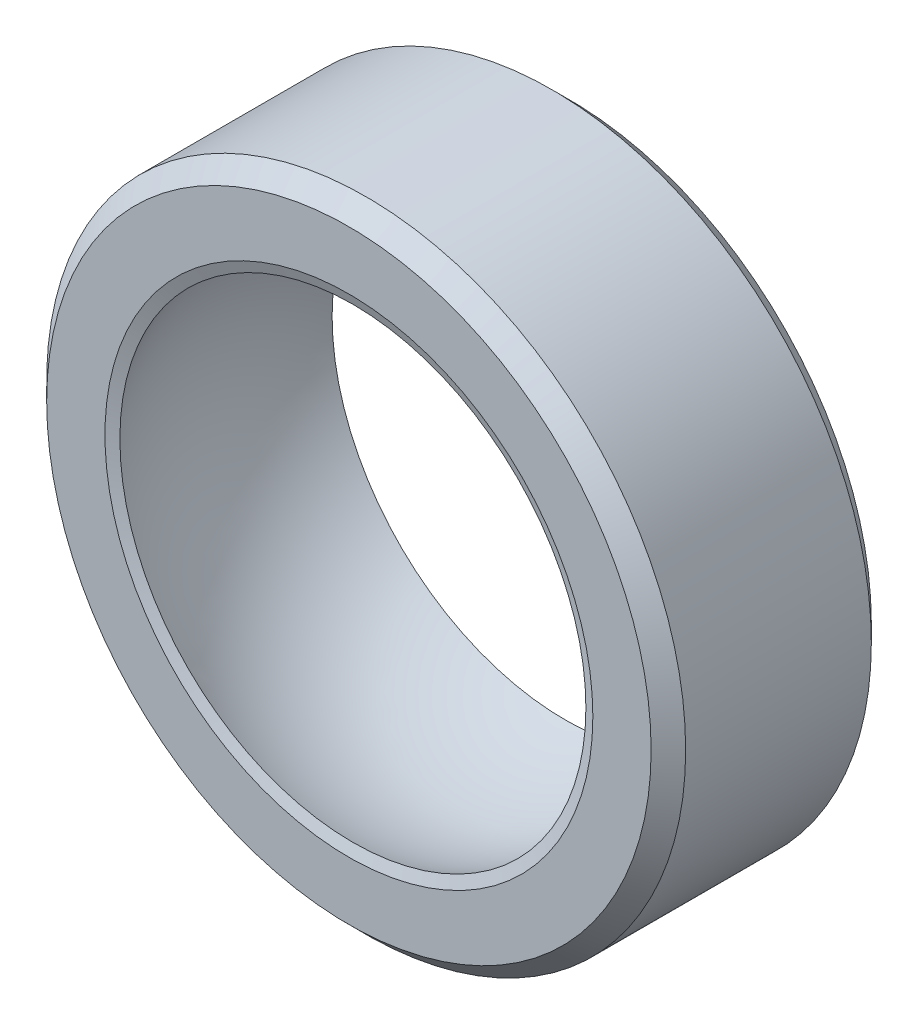
ISO-10303-21;
HEADER;
FILE_DESCRIPTION(('STEP AP214'),'2;1');
FILE_NAME('part.step','',(''),(''),'','','');
FILE_SCHEMA(('AUTOMOTIVE_DESIGN { 1 0 10303 214 1 1 1 1 }'));
ENDSEC;
DATA;
#1=APPLICATION_CONTEXT('core data for automotive mechanical design processes');
#2=APPLICATION_PROTOCOL_DEFINITION('international standard','automotive_design',2000,#1);
#3=PRODUCT_CONTEXT('',#1,'mechanical');
#4=PRODUCT('Part','Part','',(#3));
#5=PRODUCT_RELATED_PRODUCT_CATEGORY('part','',(#4));
#6=PRODUCT_DEFINITION_FORMATION('','',#4);
#7=PRODUCT_DEFINITION_CONTEXT('part definition',#1,'design');
#8=PRODUCT_DEFINITION('design','',#6,#7);
#9=PRODUCT_DEFINITION_SHAPE('','',#8);
#10=(LENGTH_UNIT() NAMED_UNIT(*) SI_UNIT(.MILLI.,.METRE.));
#11=(NAMED_UNIT(*) PLANE_ANGLE_UNIT() SI_UNIT($,.RADIAN.));
#12=(NAMED_UNIT(*) SI_UNIT($,.STERADIAN.) SOLID_ANGLE_UNIT());
#13=UNCERTAINTY_MEASURE_WITH_UNIT(LENGTH_MEASURE(1.E-05),#10,'distance_accuracy_value','');
#14=(GEOMETRIC_REPRESENTATION_CONTEXT(3) GLOBAL_UNCERTAINTY_ASSIGNED_CONTEXT((#13)) GLOBAL_UNIT_ASSIGNED_CONTEXT((#10,
#11,#12)) REPRESENTATION_CONTEXT('',''));
#15=CARTESIAN_POINT('',(0.,0.,0.));
#16=DIRECTION('',(0.,0.,1.));
#17=DIRECTION('',(1.,0.,0.));
#18=AXIS2_PLACEMENT_3D('',#15,#16,#17);
#19=CARTESIAN_POINT('',(0.,0.,-3.2385));
#20=DIRECTION('',(0.,0.,1.));
#21=DIRECTION('',(1.,0.,0.));
#22=AXIS2_PLACEMENT_3D('',#19,#20,#21);
#23=CONICAL_SURFACE('',#22,8.89,0.78539816339745);
#24=CARTESIAN_POINT('',(0.,0.,-2.7305));
#25=DIRECTION('',(0.,0.,1.));
#26=DIRECTION('',(1.,0.,0.));
#27=AXIS2_PLACEMENT_3D('',#24,#25,#26);
#28=CIRCLE('',#27,9.398);
#29=CARTESIAN_POINT('',(9.398,0.,-2.7305));
#30=VERTEX_POINT('',#29);
#31=EDGE_CURVE('E10',#30,#30,#28,.T.);
#32=ORIENTED_EDGE('',*,*,#31,.F.);
#33=EDGE_LOOP('',(#32));
#34=FACE_BOUND('',#33,.T.);
#35=CARTESIAN_POINT('',(0.,0.,-3.2385));
#36=DIRECTION('',(0.,0.,1.));
#37=DIRECTION('',(1.,0.,0.));
#38=AXIS2_PLACEMENT_3D('',#35,#36,#37);
#39=CIRCLE('',#38,8.89);
#40=CARTESIAN_POINT('',(8.89,0.,-3.2385));
#41=VERTEX_POINT('',#40);
#42=EDGE_CURVE('E69',#41,#41,#39,.T.);
#43=ORIENTED_EDGE('',*,*,#42,.T.);
#44=EDGE_LOOP('',(#43));
#45=FACE_BOUND('',#44,.T.);
#46=ADVANCED_FACE('F41',(#34,#45),#23,.T.);
#47=CARTESIAN_POINT('',(0.,0.,3.));
#48=DIRECTION('',(0.,0.,1.));
#49=DIRECTION('',(1.,0.,0.));
#50=AXIS2_PLACEMENT_3D('',#47,#48,#49);
#51=CYLINDRICAL_SURFACE('',#50,9.398);
#52=CARTESIAN_POINT('',(0.,0.,2.7305));
#53=DIRECTION('',(0.,0.,1.));
#54=DIRECTION('',(1.,0.,0.));
#55=AXIS2_PLACEMENT_3D('',#52,#53,#54);
#56=CIRCLE('',#55,9.398);
#57=CARTESIAN_POINT('',(9.398,0.,2.7305));
#58=VERTEX_POINT('',#57);
#59=EDGE_CURVE('E47',#58,#58,#56,.T.);
#60=ORIENTED_EDGE('',*,*,#59,.F.);
#61=EDGE_LOOP('',(#60));
#62=FACE_BOUND('',#61,.T.);
#63=ORIENTED_EDGE('',*,*,#31,.T.);
#64=EDGE_LOOP('',(#63));
#65=FACE_BOUND('',#64,.T.);
#66=ADVANCED_FACE('F106',(#62,#65),#51,.T.);
#67=CARTESIAN_POINT('',(0.,0.,2.7305));
#68=DIRECTION('',(0.,0.,-1.));
#69=DIRECTION('',(-1.,0.,0.));
#70=AXIS2_PLACEMENT_3D('',#67,#68,#69);
#71=CONICAL_SURFACE('',#70,9.398,0.785398163397448);
#72=CARTESIAN_POINT('',(0.,0.,3.2385));
#73=DIRECTION('',(0.,0.,1.));
#74=DIRECTION('',(1.,0.,0.));
#75=AXIS2_PLACEMENT_3D('',#72,#73,#74);
#76=CIRCLE('',#75,8.89);
#77=CARTESIAN_POINT('',(8.89,0.,3.2385));
#78=VERTEX_POINT('',#77);
#79=EDGE_CURVE('E51',#78,#78,#76,.T.);
#80=ORIENTED_EDGE('',*,*,#79,.F.);
#81=EDGE_LOOP('',(#80));
#82=FACE_BOUND('',#81,.T.);
#83=ORIENTED_EDGE('',*,*,#59,.T.);
#84=EDGE_LOOP('',(#83));
#85=FACE_BOUND('',#84,.T.);
#86=ADVANCED_FACE('F101',(#82,#85),#71,.T.);
#87=CARTESIAN_POINT('',(-8.89,0.,3.2385));
#88=DIRECTION('',(0.,0.,-1.));
#89=DIRECTION('',(-1.,0.,0.));
#90=AXIS2_PLACEMENT_3D('',#87,#88,#89);
#91=PLANE('',#90);
#92=CARTESIAN_POINT('',(0.,0.,3.2385));
#93=DIRECTION('',(0.,0.,1.));
#94=DIRECTION('',(1.,0.,0.));
#95=AXIS2_PLACEMENT_3D('',#92,#93,#94);
#96=CIRCLE('',#95,7.17579);
#97=CARTESIAN_POINT('',(7.17579,0.,3.2385));
#98=VERTEX_POINT('',#97);
#99=EDGE_CURVE('E55',#98,#98,#96,.T.);
#100=ORIENTED_EDGE('',*,*,#99,.F.);
#101=EDGE_LOOP('',(#100));
#102=FACE_BOUND('',#101,.T.);
#103=ORIENTED_EDGE('',*,*,#79,.T.);
#104=EDGE_LOOP('',(#103));
#105=FACE_BOUND('',#104,.T.);
#106=ADVANCED_FACE('F95',(#102,#105),#91,.F.);
#107=CARTESIAN_POINT('',(0.,0.,3.2385));
#108=DIRECTION('',(0.,0.,1.));
#109=DIRECTION('',(1.,0.,0.));
#110=AXIS2_PLACEMENT_3D('',#107,#108,#109);
#111=CONICAL_SURFACE('',#110,7.17579,1.22191309760307);
#112=CARTESIAN_POINT('',(0.,0.,3.12139));
#113=DIRECTION('',(0.,0.,1.));
#114=DIRECTION('',(1.,0.,0.));
#115=AXIS2_PLACEMENT_3D('',#112,#113,#114);
#116=CIRCLE('',#115,6.85385);
#117=CARTESIAN_POINT('',(-6.85385,0.,3.12139));
#118=VERTEX_POINT('',#117);
#119=EDGE_CURVE('E60',#118,#118,#116,.T.);
#120=ORIENTED_EDGE('',*,*,#119,.F.);
#121=EDGE_LOOP('',(#120));
#122=FACE_BOUND('',#121,.T.);
#123=ORIENTED_EDGE('',*,*,#99,.T.);
#124=EDGE_LOOP('',(#123));
#125=FACE_BOUND('',#124,.T.);
#126=ADVANCED_FACE('F89',(#122,#125),#111,.F.);
#127=CARTESIAN_POINT('',(0.,0.,0.));
#128=DIRECTION('',(0.,0.,1.));
#129=DIRECTION('',(-1.,0.,0.));
#130=AXIS2_PLACEMENT_3D('',#127,#128,#129);
#131=SPHERICAL_SURFACE('',#130,7.53115763708343);
#132=CARTESIAN_POINT('',(0.,0.,-3.12139));
#133=DIRECTION('',(0.,0.,1.));
#134=DIRECTION('',(1.,0.,0.));
#135=AXIS2_PLACEMENT_3D('',#132,#133,#134);
#136=CIRCLE('',#135,6.85385);
#137=CARTESIAN_POINT('',(-6.85385,0.,-3.12139));
#138=VERTEX_POINT('',#137);
#139=EDGE_CURVE('E63',#138,#138,#136,.T.);
#140=CARTESIAN_POINT('',(-6.85385,0.,-3.12139));
#141=CARTESIAN_POINT('',(-6.88164054543853,0.,-3.06036894760343));
#142=CARTESIAN_POINT('',(-6.90861575213382,0.,-2.99897658415096));
#143=CARTESIAN_POINT('',(-6.96091717276811,0.,-2.87549342287617));
#144=CARTESIAN_POINT('',(-6.98624338670709,0.,-2.81340262505383));
#145=CARTESIAN_POINT('',(-7.03522850655887,0.,-2.6885667827812));
#146=CARTESIAN_POINT('',(-7.05888741247168,0.,-2.6258217383309));
#147=CARTESIAN_POINT('',(-7.1045211055855,0.,-2.49972219075851));
#148=CARTESIAN_POINT('',(-7.12649589278653,0.,-2.43636768763641));
#149=CARTESIAN_POINT('',(-7.16874565471623,0.,-2.3090944096678));
#150=CARTESIAN_POINT('',(-7.18902062944492,0.,-2.24517563482129));
#151=CARTESIAN_POINT('',(-7.22785630787594,0.,-2.11681941246455));
#152=CARTESIAN_POINT('',(-7.24641701157827,0.,-2.05238196495431));
#153=CARTESIAN_POINT('',(-7.28181090622963,0.,-1.92303436376237));
#154=CARTESIAN_POINT('',(-7.29864409717864,0.,-1.85812421008065));
#155=CARTESIAN_POINT('',(-7.33057095855796,0.,-1.72787750093535));
#156=CARTESIAN_POINT('',(-7.34566462898825,0.,-1.66254094547177));
#157=CARTESIAN_POINT('',(-7.37410168203206,0.,-1.53148804114553));
#158=CARTESIAN_POINT('',(-7.38744506464556,0.,-1.46577169228287));
#159=CARTESIAN_POINT('',(-7.41237202345795,0.,-1.33400608051972));
#160=CARTESIAN_POINT('',(-7.42395559965684,0.,-1.26795681761923));
#161=CARTESIAN_POINT('',(-7.44535468238475,0.,-1.13557249461566));
#162=CARTESIAN_POINT('',(-7.45517018891376,0.,-1.06923743451257));
#163=CARTESIAN_POINT('',(-7.47302613032346,0.,-0.936328837818619));
#164=CARTESIAN_POINT('',(-7.48106656520415,0.,-0.869755301227748));
#165=CARTESIAN_POINT('',(-7.49536662759993,0.,-0.736417242391426));
#166=CARTESIAN_POINT('',(-7.50162625511502,0.,-0.669652720145976));
#167=CARTESIAN_POINT('',(-7.5123602374179,0.,-0.5359803170753));
#168=CARTESIAN_POINT('',(-7.51683459220569,0.,-0.469072436250075));
#169=CARTESIAN_POINT('',(-7.52399483723257,0.,-0.335161045360723));
#170=CARTESIAN_POINT('',(-7.52668072747166,0.,-0.268157535296596));
#171=CARTESIAN_POINT('',(-7.53026212739709,0.,-0.134102683488313));
#172=CARTESIAN_POINT('',(-7.53115763708343,0.,-0.0670513417441574));
#173=CARTESIAN_POINT('',(-7.53115763708343,0.,0.0670513417441541));
#174=CARTESIAN_POINT('',(-7.53026212739709,0.,0.13410268348831));
#175=CARTESIAN_POINT('',(-7.52668072747166,0.,0.268157535296592));
#176=CARTESIAN_POINT('',(-7.52399483723258,0.,0.335161045360719));
#177=CARTESIAN_POINT('',(-7.51683459220569,0.,0.469072436250071));
#178=CARTESIAN_POINT('',(-7.5123602374179,0.,0.535980317075297));
#179=CARTESIAN_POINT('',(-7.50162625511502,0.,0.669652720145972));
#180=CARTESIAN_POINT('',(-7.49536662759993,0.,0.736417242391423));
#181=CARTESIAN_POINT('',(-7.48106656520415,0.,0.869755301227745));
#182=CARTESIAN_POINT('',(-7.47302613032346,0.,0.936328837818616));
#183=CARTESIAN_POINT('',(-7.45517018891376,0.,1.06923743451257));
#184=CARTESIAN_POINT('',(-7.44535468238475,0.,1.13557249461565));
#185=CARTESIAN_POINT('',(-7.42395559965684,0.,1.26795681761923));
#186=CARTESIAN_POINT('',(-7.41237202345795,0.,1.33400608051972));
#187=CARTESIAN_POINT('',(-7.38744506464556,0.,1.46577169228287));
#188=CARTESIAN_POINT('',(-7.37410168203206,0.,1.53148804114553));
#189=CARTESIAN_POINT('',(-7.34566462898826,0.,1.66254094547177));
#190=CARTESIAN_POINT('',(-7.33057095855796,0.,1.72787750093535));
#191=CARTESIAN_POINT('',(-7.29864409717864,0.,1.85812421008065));
#192=CARTESIAN_POINT('',(-7.28181090622963,0.,1.92303436376236));
#193=CARTESIAN_POINT('',(-7.24641701157827,0.,2.05238196495431));
#194=CARTESIAN_POINT('',(-7.22785630787594,0.,2.11681941246454));
#195=CARTESIAN_POINT('',(-7.18902062944492,0.,2.24517563482129));
#196=CARTESIAN_POINT('',(-7.16874565471624,0.,2.3090944096678));
#197=CARTESIAN_POINT('',(-7.12649589278653,0.,2.43636768763641));
#198=CARTESIAN_POINT('',(-7.1045211055855,0.,2.49972219075851));
#199=CARTESIAN_POINT('',(-7.05888741247168,0.,2.6258217383309));
#200=CARTESIAN_POINT('',(-7.03522850655888,0.,2.6885667827812));
#201=CARTESIAN_POINT('',(-6.98624338670709,0.,2.81340262505383));
#202=CARTESIAN_POINT('',(-6.96091717276811,0.,2.87549342287616));
#203=CARTESIAN_POINT('',(-6.90861575213383,0.,2.99897658415096));
#204=CARTESIAN_POINT('',(-6.88164054543853,0.,3.06036894760342));
#205=CARTESIAN_POINT('',(-6.85385,0.,3.12139));
#206=B_SPLINE_CURVE_WITH_KNOTS('',3,(#140,#141,#142,#143,#144,#145,#146,#147,#148,#149,#150,
#151,#152,#153,#154,#155,#156,#157,#158,#159,#160,#161,#162,#163,#164,#165,#166,#167,#168,#169,
#170,#171,#172,#173,#174,#175,#176,#177,#178,#179,#180,#181,#182,#183,#184,#185,#186,#187,#188,
#189,#190,#191,#192,#193,#194,#195,#196,#197,#198,#199,#200,#201,#202,#203,#204,#205),
.UNSPECIFIED.,.F.,.F.,(4,2,2,2,2,2,2,2,2,2,2,2,2,2,2,2,2,2,2,2,2,2,2,2,2,2,2,2,2,2,2,2,4),(0.,
0.201148046539107,0.402296093078214,0.603444139617321,0.804592186156427,1.00574023269553,
1.20688827923464,1.40803632577375,1.60918437231285,1.81033241885196,2.01148046539107,
2.21262851193017,2.41377655846928,2.61492460500839,2.8160726515475,3.0172206980866,
3.21836874462571,3.41951679116482,3.62066483770392,3.82181288424303,4.02296093078214,
4.22410897732124,4.42525702386035,4.62640507039946,4.82755311693856,5.02870116347767,
5.22984921001678,5.43099725655588,5.63214530309499,5.8332933496341,6.03444139617321,
6.23558944271231,6.43673748925142),.UNSPECIFIED.);
#207=EDGE_CURVE('BSEAM83',#138,#118,#206,.T.);
#208=ORIENTED_EDGE('',*,*,#139,.F.);
#209=ORIENTED_EDGE('',*,*,#119,.T.);
#210=ORIENTED_EDGE('',*,*,#207,.T.);
#211=ORIENTED_EDGE('',*,*,#207,.F.);
#212=EDGE_LOOP('',(#208,#210,#209,#211));
#213=FACE_BOUND('',#212,.T.);
#214=ADVANCED_FACE('F83',(#213),#131,.F.);
#215=CARTESIAN_POINT('',(0.,0.,-3.12139));
#216=DIRECTION('',(0.,0.,-1.));
#217=DIRECTION('',(-1.,0.,0.));
#218=AXIS2_PLACEMENT_3D('',#215,#216,#217);
#219=CONICAL_SURFACE('',#218,6.85385,1.22191309760308);
#220=CARTESIAN_POINT('',(0.,0.,-3.2385));
#221=DIRECTION('',(0.,0.,1.));
#222=DIRECTION('',(1.,0.,0.));
#223=AXIS2_PLACEMENT_3D('',#220,#221,#222);
#224=CIRCLE('',#223,7.17579);
#225=CARTESIAN_POINT('',(7.17579,0.,-3.2385));
#226=VERTEX_POINT('',#225);
#227=EDGE_CURVE('E66',#226,#226,#224,.T.);
#228=ORIENTED_EDGE('',*,*,#227,.F.);
#229=EDGE_LOOP('',(#228));
#230=FACE_BOUND('',#229,.T.);
#231=ORIENTED_EDGE('',*,*,#139,.T.);
#232=EDGE_LOOP('',(#231));
#233=FACE_BOUND('',#232,.T.);
#234=ADVANCED_FACE('F77',(#230,#233),#219,.F.);
#235=CARTESIAN_POINT('',(-8.89,0.,-3.2385));
#236=DIRECTION('',(0.,0.,1.));
#237=DIRECTION('',(1.,0.,0.));
#238=AXIS2_PLACEMENT_3D('',#235,#236,#237);
#239=PLANE('',#238);
#240=ORIENTED_EDGE('',*,*,#42,.F.);
#241=EDGE_LOOP('',(#240));
#242=FACE_BOUND('',#241,.T.);
#243=ORIENTED_EDGE('',*,*,#227,.T.);
#244=EDGE_LOOP('',(#243));
#245=FACE_BOUND('',#244,.T.);
#246=ADVANCED_FACE('F74',(#242,#245),#239,.F.);
#247=CLOSED_SHELL('',(#46,#66,#86,#106,#126,#214,#234,#246));
#248=MANIFOLD_SOLID_BREP('B2',#247);
#249=ADVANCED_BREP_SHAPE_REPRESENTATION('',(#18,#248),#14);
#250=SHAPE_DEFINITION_REPRESENTATION(#9,#249);
ENDSEC;
END-ISO-10303-21;
